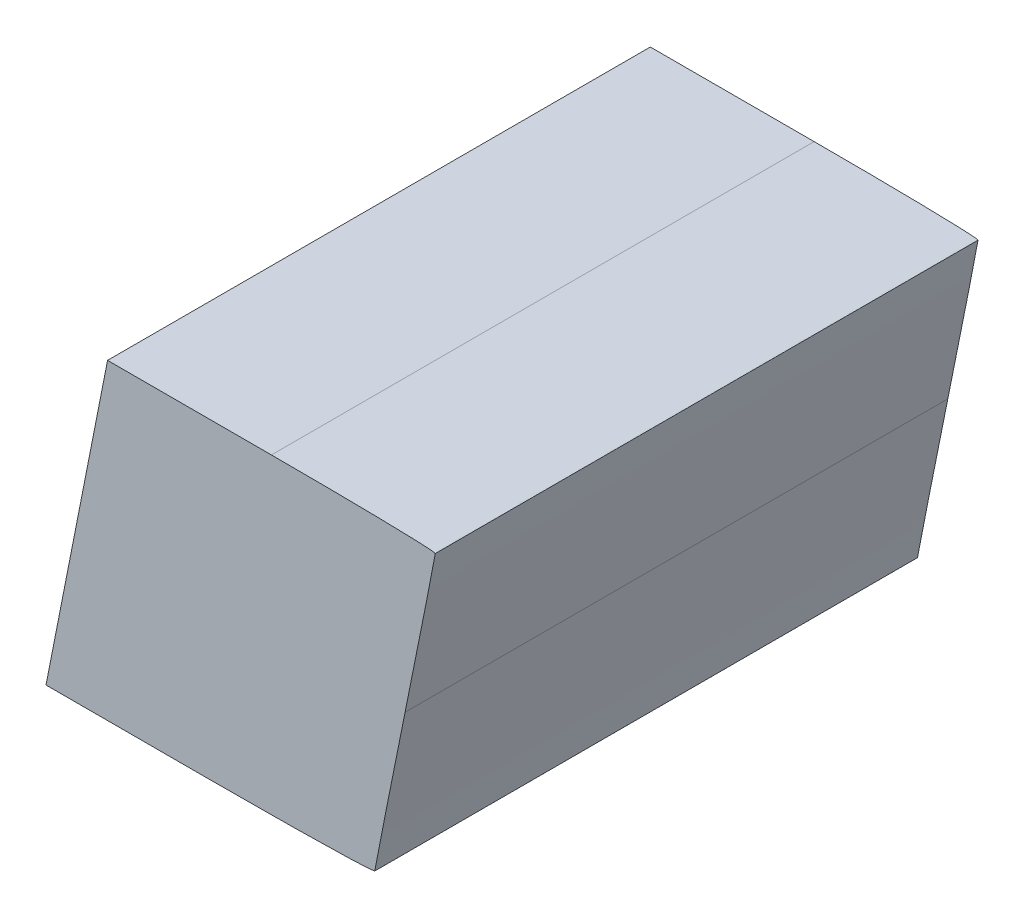
ISO-10303-21;
HEADER;
FILE_DESCRIPTION(('STEP AP214'),'2;1');
FILE_NAME('part.step','',(''),(''),'','','');
FILE_SCHEMA(('AUTOMOTIVE_DESIGN { 1 0 10303 214 1 1 1 1 }'));
ENDSEC;
DATA;
#1=APPLICATION_CONTEXT('core data for automotive mechanical design processes');
#2=APPLICATION_PROTOCOL_DEFINITION('international standard','automotive_design',2000,#1);
#3=PRODUCT_CONTEXT('',#1,'mechanical');
#4=PRODUCT('Part','Part','',(#3));
#5=PRODUCT_RELATED_PRODUCT_CATEGORY('part','',(#4));
#6=PRODUCT_DEFINITION_FORMATION('','',#4);
#7=PRODUCT_DEFINITION_CONTEXT('part definition',#1,'design');
#8=PRODUCT_DEFINITION('design','',#6,#7);
#9=PRODUCT_DEFINITION_SHAPE('','',#8);
#10=(LENGTH_UNIT() NAMED_UNIT(*) SI_UNIT(.MILLI.,.METRE.));
#11=(NAMED_UNIT(*) PLANE_ANGLE_UNIT() SI_UNIT($,.RADIAN.));
#12=(NAMED_UNIT(*) SI_UNIT($,.STERADIAN.) SOLID_ANGLE_UNIT());
#13=UNCERTAINTY_MEASURE_WITH_UNIT(LENGTH_MEASURE(1.E-05),#10,'distance_accuracy_value','');
#14=(GEOMETRIC_REPRESENTATION_CONTEXT(3) GLOBAL_UNCERTAINTY_ASSIGNED_CONTEXT((#13)) GLOBAL_UNIT_ASSIGNED_CONTEXT((#10,
#11,#12)) REPRESENTATION_CONTEXT('',''));
#15=CARTESIAN_POINT('',(0.,0.,0.));
#16=DIRECTION('',(0.,0.,1.));
#17=DIRECTION('',(1.,0.,0.));
#18=AXIS2_PLACEMENT_3D('',#15,#16,#17);
#19=CARTESIAN_POINT('',(0.423061030559,0.211378781458,0.));
#20=DIRECTION('',(-0.9810807675331,0.193598883200971,0.));
#21=DIRECTION('',(-0.193598883200971,-0.9810807675331,0.));
#22=AXIS2_PLACEMENT_3D('',#19,#20,#21);
#23=PLANE('',#22);
#24=DIRECTION('',(-0.193598883200971,-0.9810807675331,0.));
#25=VECTOR('',#24,1.);
#26=CARTESIAN_POINT('',(0.423061030559,0.211378781458,0.));
#27=LINE('',#26,#25);
#28=CARTESIAN_POINT('',(0.423061030559,0.211378781458,0.));
#29=VERTEX_POINT('',#28);
#30=CARTESIAN_POINT('',(0.417389681729,0.182638681458,0.));
#31=VERTEX_POINT('',#30);
#32=EDGE_CURVE('E11',#29,#31,#27,.T.);
#33=ORIENTED_EDGE('',*,*,#32,.T.);
#34=DIRECTION('',(0.,0.,1.));
#35=VECTOR('',#34,1.);
#36=CARTESIAN_POINT('',(0.417389681729,0.182638681458,0.));
#37=LINE('',#36,#35);
#38=CARTESIAN_POINT('',(0.417389681729,0.182638681458,0.1));
#39=VERTEX_POINT('',#38);
#40=EDGE_CURVE('E24',#31,#39,#37,.T.);
#41=ORIENTED_EDGE('',*,*,#40,.T.);
#42=DIRECTION('',(-0.193598883200971,-0.9810807675331,0.));
#43=VECTOR('',#42,1.);
#44=CARTESIAN_POINT('',(0.423061030559,0.211378781458,0.1));
#45=LINE('',#44,#43);
#46=CARTESIAN_POINT('',(0.423061030559,0.211378781458,0.1));
#47=VERTEX_POINT('',#46);
#48=EDGE_CURVE('E100',#47,#39,#45,.T.);
#49=ORIENTED_EDGE('',*,*,#48,.F.);
#50=DIRECTION('',(0.,0.,1.));
#51=VECTOR('',#50,1.);
#52=CARTESIAN_POINT('',(0.423061030559,0.211378781458,0.));
#53=LINE('',#52,#51);
#54=EDGE_CURVE('E186',#29,#47,#53,.T.);
#55=ORIENTED_EDGE('',*,*,#54,.F.);
#56=EDGE_LOOP('',(#33,#41,#49,#55));
#57=FACE_BOUND('',#56,.T.);
#58=ADVANCED_FACE('F17',(#57),#23,.T.);
#59=CARTESIAN_POINT('',(0.453250428905,0.211378781458,0.));
#60=DIRECTION('',(0.,1.,0.));
#61=DIRECTION('',(-1.,0.,0.));
#62=AXIS2_PLACEMENT_3D('',#59,#60,#61);
#63=PLANE('',#62);
#64=DIRECTION('',(-1.,0.,0.));
#65=VECTOR('',#64,1.);
#66=CARTESIAN_POINT('',(0.453250428905,0.211378781458,0.));
#67=LINE('',#66,#65);
#68=CARTESIAN_POINT('',(0.453250428905,0.211378781458,0.));
#69=VERTEX_POINT('',#68);
#70=EDGE_CURVE('E183',#69,#29,#67,.T.);
#71=ORIENTED_EDGE('',*,*,#70,.T.);
#72=ORIENTED_EDGE('',*,*,#54,.T.);
#73=DIRECTION('',(-1.,0.,0.));
#74=VECTOR('',#73,1.);
#75=CARTESIAN_POINT('',(0.453250428905,0.211378781458,0.1));
#76=LINE('',#75,#74);
#77=CARTESIAN_POINT('',(0.453250428905,0.211378781458,0.1));
#78=VERTEX_POINT('',#77);
#79=EDGE_CURVE('E181',#78,#47,#76,.T.);
#80=ORIENTED_EDGE('',*,*,#79,.F.);
#81=DIRECTION('',(0.,0.,1.));
#82=VECTOR('',#81,1.);
#83=CARTESIAN_POINT('',(0.453250428905,0.211378781458,0.));
#84=LINE('',#83,#82);
#85=EDGE_CURVE('E175',#69,#78,#84,.T.);
#86=ORIENTED_EDGE('',*,*,#85,.F.);
#87=EDGE_LOOP('',(#71,#72,#80,#86));
#88=FACE_BOUND('',#87,.T.);
#89=ADVANCED_FACE('F203',(#88),#63,.T.);
#90=CARTESIAN_POINT('',(0.483439808709,0.210740973742,0.));
#91=CARTESIAN_POINT('',(0.483439808709,0.210740973742,0.1));
#92=CARTESIAN_POINT('',(0.483439808709,0.21109176984,0.));
#93=CARTESIAN_POINT('',(0.483439808709,0.21109176984,0.1));
#94=CARTESIAN_POINT('',(0.469854585943,0.211378781458,0.));
#95=CARTESIAN_POINT('',(0.469854585943,0.211378781458,0.1));
#96=CARTESIAN_POINT('',(0.453250428905,0.211378781458,0.));
#97=CARTESIAN_POINT('',(0.453250428905,0.211378781458,0.1));
#98=B_SPLINE_SURFACE_WITH_KNOTS('',3,1,((#90,#91),(#92,#93),(#94,#95),(#96,#97)),.UNSPECIFIED.,
.F.,.F.,.F.,(4,4),(2,2),(0.,1.),(0.,0.01),.UNSPECIFIED.);
#99=CARTESIAN_POINT('',(0.483439808709,0.210740973742,0.));
#100=CARTESIAN_POINT('',(0.483439808709,0.21109176984,0.));
#101=CARTESIAN_POINT('',(0.469854585943,0.211378781458,0.));
#102=CARTESIAN_POINT('',(0.453250428905,0.211378781458,0.));
#103=B_SPLINE_CURVE_WITH_KNOTS('',3,(#99,#100,#101,#102),.UNSPECIFIED.,.F.,.F.,(4,4),(0.,1.),.UNSPECIFIED.);
#104=CARTESIAN_POINT('',(0.483439808709,0.210740973742,0.));
#105=VERTEX_POINT('',#104);
#106=EDGE_CURVE('E167',#105,#69,#103,.T.);
#107=CARTESIAN_POINT('',(0.483439808709,0.210740973742,0.1));
#108=CARTESIAN_POINT('',(0.483439808709,0.21109176984,0.1));
#109=CARTESIAN_POINT('',(0.469854585943,0.211378781458,0.1));
#110=CARTESIAN_POINT('',(0.453250428905,0.211378781458,0.1));
#111=B_SPLINE_CURVE_WITH_KNOTS('',3,(#107,#108,#109,#110),.UNSPECIFIED.,.F.,.F.,(4,4),(0.,1.),.UNSPECIFIED.);
#112=CARTESIAN_POINT('',(0.483439808709,0.210740973742,0.1));
#113=VERTEX_POINT('',#112);
#114=EDGE_CURVE('E162',#113,#78,#111,.T.);
#115=DIRECTION('',(0.,0.,1.));
#116=VECTOR('',#115,1.);
#117=CARTESIAN_POINT('',(0.483439808709,0.210740973742,0.));
#118=LINE('',#117,#116);
#119=EDGE_CURVE('E156',#105,#113,#118,.T.);
#120=ORIENTED_EDGE('',*,*,#106,.T.);
#121=ORIENTED_EDGE('',*,*,#85,.T.);
#122=ORIENTED_EDGE('',*,*,#114,.F.);
#123=ORIENTED_EDGE('',*,*,#119,.F.);
#124=EDGE_LOOP('',(#120,#121,#122,#123));
#125=FACE_BOUND('',#124,.T.);
#126=ADVANCED_FACE('F200',(#125),#98,.T.);
#127=CARTESIAN_POINT('',(0.477877208709,0.182638681458,0.));
#128=CARTESIAN_POINT('',(0.477877208709,0.182638681458,0.1));
#129=CARTESIAN_POINT('',(0.480936638709,0.197744144262,0.));
#130=CARTESIAN_POINT('',(0.480936638709,0.197744144262,0.1));
#131=CARTESIAN_POINT('',(0.483439808709,0.210390177644,0.));
#132=CARTESIAN_POINT('',(0.483439808709,0.210390177644,0.1));
#133=CARTESIAN_POINT('',(0.483439808709,0.210740973742,0.));
#134=CARTESIAN_POINT('',(0.483439808709,0.210740973742,0.1));
#135=B_SPLINE_SURFACE_WITH_KNOTS('',3,1,((#127,#128),(#129,#130),(#131,#132),(#133,#134)),
.UNSPECIFIED.,.F.,.F.,.F.,(4,4),(2,2),(0.,1.),(0.,0.01),.UNSPECIFIED.);
#136=CARTESIAN_POINT('',(0.477877208709,0.182638681458,0.));
#137=CARTESIAN_POINT('',(0.480936638709,0.197744144262,0.));
#138=CARTESIAN_POINT('',(0.483439808709,0.210390177644,0.));
#139=CARTESIAN_POINT('',(0.483439808709,0.210740973742,0.));
#140=B_SPLINE_CURVE_WITH_KNOTS('',3,(#136,#137,#138,#139),.UNSPECIFIED.,.F.,.F.,(4,4),(0.,1.),.UNSPECIFIED.);
#141=CARTESIAN_POINT('',(0.477877208709,0.182638681458,0.));
#142=VERTEX_POINT('',#141);
#143=EDGE_CURVE('E148',#142,#105,#140,.T.);
#144=CARTESIAN_POINT('',(0.477877208709,0.182638681458,0.1));
#145=CARTESIAN_POINT('',(0.480936638709,0.197744144262,0.1));
#146=CARTESIAN_POINT('',(0.483439808709,0.210390177644,0.1));
#147=CARTESIAN_POINT('',(0.483439808709,0.210740973742,0.1));
#148=B_SPLINE_CURVE_WITH_KNOTS('',3,(#144,#145,#146,#147),.UNSPECIFIED.,.F.,.F.,(4,4),(0.,1.),.UNSPECIFIED.);
#149=CARTESIAN_POINT('',(0.477877208709,0.182638681458,0.1));
#150=VERTEX_POINT('',#149);
#151=EDGE_CURVE('E143',#150,#113,#148,.T.);
#152=DIRECTION('',(0.,0.,1.));
#153=VECTOR('',#152,1.);
#154=CARTESIAN_POINT('',(0.477877208709,0.182638681458,0.));
#155=LINE('',#154,#153);
#156=EDGE_CURVE('E137',#142,#150,#155,.T.);
#157=ORIENTED_EDGE('',*,*,#143,.T.);
#158=ORIENTED_EDGE('',*,*,#119,.T.);
#159=ORIENTED_EDGE('',*,*,#151,.F.);
#160=ORIENTED_EDGE('',*,*,#156,.F.);
#161=EDGE_LOOP('',(#157,#158,#159,#160));
#162=FACE_BOUND('',#161,.T.);
#163=ADVANCED_FACE('F197',(#162),#135,.T.);
#164=CARTESIAN_POINT('',(0.472314608709,0.154536389174,0.));
#165=CARTESIAN_POINT('',(0.472314608709,0.154536389174,0.1));
#166=CARTESIAN_POINT('',(0.472314608709,0.154887185272,0.));
#167=CARTESIAN_POINT('',(0.472314608709,0.154887185272,0.1));
#168=CARTESIAN_POINT('',(0.474817778709,0.167533218654,0.));
#169=CARTESIAN_POINT('',(0.474817778709,0.167533218654,0.1));
#170=CARTESIAN_POINT('',(0.477877208709,0.182638681458,0.));
#171=CARTESIAN_POINT('',(0.477877208709,0.182638681458,0.1));
#172=B_SPLINE_SURFACE_WITH_KNOTS('',3,1,((#164,#165),(#166,#167),(#168,#169),(#170,#171)),
.UNSPECIFIED.,.F.,.F.,.F.,(4,4),(2,2),(0.,1.),(0.,0.01),.UNSPECIFIED.);
#173=CARTESIAN_POINT('',(0.472314608709,0.154536389174,0.));
#174=CARTESIAN_POINT('',(0.472314608709,0.154887185272,0.));
#175=CARTESIAN_POINT('',(0.474817778709,0.167533218654,0.));
#176=CARTESIAN_POINT('',(0.477877208709,0.182638681458,0.));
#177=B_SPLINE_CURVE_WITH_KNOTS('',3,(#173,#174,#175,#176),.UNSPECIFIED.,.F.,.F.,(4,4),(0.,1.),.UNSPECIFIED.);
#178=CARTESIAN_POINT('',(0.472314608709,0.154536389174,0.));
#179=VERTEX_POINT('',#178);
#180=EDGE_CURVE('E129',#179,#142,#177,.T.);
#181=CARTESIAN_POINT('',(0.472314608709,0.154536389174,0.1));
#182=CARTESIAN_POINT('',(0.472314608709,0.154887185272,0.1));
#183=CARTESIAN_POINT('',(0.474817778709,0.167533218654,0.1));
#184=CARTESIAN_POINT('',(0.477877208709,0.182638681458,0.1));
#185=B_SPLINE_CURVE_WITH_KNOTS('',3,(#181,#182,#183,#184),.UNSPECIFIED.,.F.,.F.,(4,4),(0.,1.),.UNSPECIFIED.);
#186=CARTESIAN_POINT('',(0.472314608709,0.154536389174,0.1));
#187=VERTEX_POINT('',#186);
#188=EDGE_CURVE('E124',#187,#150,#185,.T.);
#189=DIRECTION('',(0.,0.,1.));
#190=VECTOR('',#189,1.);
#191=CARTESIAN_POINT('',(0.472314608709,0.154536389174,0.));
#192=LINE('',#191,#190);
#193=EDGE_CURVE('E118',#179,#187,#192,.T.);
#194=ORIENTED_EDGE('',*,*,#180,.T.);
#195=ORIENTED_EDGE('',*,*,#156,.T.);
#196=ORIENTED_EDGE('',*,*,#188,.F.);
#197=ORIENTED_EDGE('',*,*,#193,.F.);
#198=EDGE_LOOP('',(#194,#195,#196,#197));
#199=FACE_BOUND('',#198,.T.);
#200=ADVANCED_FACE('F194',(#199),#172,.T.);
#201=CARTESIAN_POINT('',(0.442016480075,0.153898581458,0.));
#202=CARTESIAN_POINT('',(0.442016480075,0.153898581458,0.1));
#203=CARTESIAN_POINT('',(0.458680453605,0.153898581458,0.));
#204=CARTESIAN_POINT('',(0.458680453605,0.153898581458,0.1));
#205=CARTESIAN_POINT('',(0.472314608709,0.154185593076,0.));
#206=CARTESIAN_POINT('',(0.472314608709,0.154185593076,0.1));
#207=CARTESIAN_POINT('',(0.472314608709,0.154536389174,0.));
#208=CARTESIAN_POINT('',(0.472314608709,0.154536389174,0.1));
#209=B_SPLINE_SURFACE_WITH_KNOTS('',3,1,((#201,#202),(#203,#204),(#205,#206),(#207,#208)),
.UNSPECIFIED.,.F.,.F.,.F.,(4,4),(2,2),(0.,1.),(0.,0.01),.UNSPECIFIED.);
#210=CARTESIAN_POINT('',(0.442016480075,0.153898581458,0.));
#211=CARTESIAN_POINT('',(0.458680453605,0.153898581458,0.));
#212=CARTESIAN_POINT('',(0.472314608709,0.154185593076,0.));
#213=CARTESIAN_POINT('',(0.472314608709,0.154536389174,0.));
#214=B_SPLINE_CURVE_WITH_KNOTS('',3,(#210,#211,#212,#213),.UNSPECIFIED.,.F.,.F.,(4,4),(0.,1.),.UNSPECIFIED.);
#215=CARTESIAN_POINT('',(0.442016480075,0.153898581458,0.));
#216=VERTEX_POINT('',#215);
#217=EDGE_CURVE('E110',#216,#179,#214,.T.);
#218=CARTESIAN_POINT('',(0.442016480075,0.153898581458,0.1));
#219=CARTESIAN_POINT('',(0.458680453605,0.153898581458,0.1));
#220=CARTESIAN_POINT('',(0.472314608709,0.154185593076,0.1));
#221=CARTESIAN_POINT('',(0.472314608709,0.154536389174,0.1));
#222=B_SPLINE_CURVE_WITH_KNOTS('',3,(#218,#219,#220,#221),.UNSPECIFIED.,.F.,.F.,(4,4),(0.,1.),.UNSPECIFIED.);
#223=CARTESIAN_POINT('',(0.442016480075,0.153898581458,0.1));
#224=VERTEX_POINT('',#223);
#225=EDGE_CURVE('E106',#224,#187,#222,.T.);
#226=DIRECTION('',(0.,0.,1.));
#227=VECTOR('',#226,1.);
#228=CARTESIAN_POINT('',(0.442016480075,0.153898581458,0.));
#229=LINE('',#228,#227);
#230=EDGE_CURVE('E85',#216,#224,#229,.T.);
#231=ORIENTED_EDGE('',*,*,#217,.T.);
#232=ORIENTED_EDGE('',*,*,#193,.T.);
#233=ORIENTED_EDGE('',*,*,#225,.F.);
#234=ORIENTED_EDGE('',*,*,#230,.F.);
#235=EDGE_LOOP('',(#231,#232,#233,#234));
#236=FACE_BOUND('',#235,.T.);
#237=ADVANCED_FACE('F192',(#236),#209,.T.);
#238=CARTESIAN_POINT('',(0.411718351441,0.153898581458,0.));
#239=DIRECTION('',(0.,-1.,0.));
#240=DIRECTION('',(1.,0.,0.));
#241=AXIS2_PLACEMENT_3D('',#238,#239,#240);
#242=PLANE('',#241);
#243=DIRECTION('',(1.,0.,0.));
#244=VECTOR('',#243,1.);
#245=CARTESIAN_POINT('',(0.411718351441,0.153898581458,0.));
#246=LINE('',#245,#244);
#247=CARTESIAN_POINT('',(0.411718351441,0.153898581458,0.));
#248=VERTEX_POINT('',#247);
#249=EDGE_CURVE('E89',#248,#216,#246,.T.);
#250=ORIENTED_EDGE('',*,*,#249,.T.);
#251=ORIENTED_EDGE('',*,*,#230,.T.);
#252=DIRECTION('',(1.,0.,0.));
#253=VECTOR('',#252,1.);
#254=CARTESIAN_POINT('',(0.411718351441,0.153898581458,0.1));
#255=LINE('',#254,#253);
#256=CARTESIAN_POINT('',(0.411718351441,0.153898581458,0.1));
#257=VERTEX_POINT('',#256);
#258=EDGE_CURVE('E78',#257,#224,#255,.T.);
#259=ORIENTED_EDGE('',*,*,#258,.F.);
#260=DIRECTION('',(0.,0.,1.));
#261=VECTOR('',#260,1.);
#262=CARTESIAN_POINT('',(0.411718351441,0.153898581458,0.));
#263=LINE('',#262,#261);
#264=EDGE_CURVE('E82',#248,#257,#263,.T.);
#265=ORIENTED_EDGE('',*,*,#264,.F.);
#266=EDGE_LOOP('',(#250,#251,#259,#265));
#267=FACE_BOUND('',#266,.T.);
#268=ADVANCED_FACE('F81',(#267),#242,.T.);
#269=CARTESIAN_POINT('',(0.417389681729,0.182638681458,0.));
#270=DIRECTION('',(-0.981080887754018,0.19359827396903,0.));
#271=DIRECTION('',(-0.19359827396903,-0.981080887754018,0.));
#272=AXIS2_PLACEMENT_3D('',#269,#270,#271);
#273=PLANE('',#272);
#274=DIRECTION('',(-0.19359827396903,-0.981080887754018,0.));
#275=VECTOR('',#274,1.);
#276=CARTESIAN_POINT('',(0.417389681729,0.182638681458,0.));
#277=LINE('',#276,#275);
#278=EDGE_CURVE('E95',#31,#248,#277,.T.);
#279=ORIENTED_EDGE('',*,*,#278,.T.);
#280=ORIENTED_EDGE('',*,*,#264,.T.);
#281=DIRECTION('',(-0.19359827396903,-0.981080887754018,0.));
#282=VECTOR('',#281,1.);
#283=CARTESIAN_POINT('',(0.417389681729,0.182638681458,0.1));
#284=LINE('',#283,#282);
#285=EDGE_CURVE('E94',#39,#257,#284,.T.);
#286=ORIENTED_EDGE('',*,*,#285,.F.);
#287=ORIENTED_EDGE('',*,*,#40,.F.);
#288=EDGE_LOOP('',(#279,#280,#286,#287));
#289=FACE_BOUND('',#288,.T.);
#290=ADVANCED_FACE('F93',(#289),#273,.T.);
#291=CARTESIAN_POINT('',(0.444256227104842,0.182612383456189,0.1));
#292=DIRECTION('',(0.,0.,1.));
#293=DIRECTION('',(1.,0.,0.));
#294=AXIS2_PLACEMENT_3D('',#291,#292,#293);
#295=PLANE('',#294);
#296=ORIENTED_EDGE('',*,*,#285,.T.);
#297=ORIENTED_EDGE('',*,*,#258,.T.);
#298=ORIENTED_EDGE('',*,*,#225,.T.);
#299=ORIENTED_EDGE('',*,*,#188,.T.);
#300=ORIENTED_EDGE('',*,*,#151,.T.);
#301=ORIENTED_EDGE('',*,*,#114,.T.);
#302=ORIENTED_EDGE('',*,*,#79,.T.);
#303=ORIENTED_EDGE('',*,*,#48,.T.);
#304=EDGE_LOOP('',(#296,#297,#298,#299,#300,#301,#302,#303));
#305=FACE_BOUND('',#304,.T.);
#306=ADVANCED_FACE('F98',(#305),#295,.T.);
#307=CARTESIAN_POINT('',(0.444256227104842,0.182612383456189,0.));
#308=DIRECTION('',(0.,0.,1.));
#309=DIRECTION('',(1.,0.,0.));
#310=AXIS2_PLACEMENT_3D('',#307,#308,#309);
#311=PLANE('',#310);
#312=ORIENTED_EDGE('',*,*,#278,.F.);
#313=ORIENTED_EDGE('',*,*,#32,.F.);
#314=ORIENTED_EDGE('',*,*,#70,.F.);
#315=ORIENTED_EDGE('',*,*,#106,.F.);
#316=ORIENTED_EDGE('',*,*,#143,.F.);
#317=ORIENTED_EDGE('',*,*,#180,.F.);
#318=ORIENTED_EDGE('',*,*,#217,.F.);
#319=ORIENTED_EDGE('',*,*,#249,.F.);
#320=EDGE_LOOP('',(#312,#313,#314,#315,#316,#317,#318,#319));
#321=FACE_BOUND('',#320,.T.);
#322=ADVANCED_FACE('F189',(#321),#311,.F.);
#323=CLOSED_SHELL('',(#58,#89,#126,#163,#200,#237,#268,#290,#306,#322));
#324=MANIFOLD_SOLID_BREP('B1',#323);
#325=ADVANCED_BREP_SHAPE_REPRESENTATION('',(#18,#324),#14);
#326=SHAPE_DEFINITION_REPRESENTATION(#9,#325);
ENDSEC;
END-ISO-10303-21;
